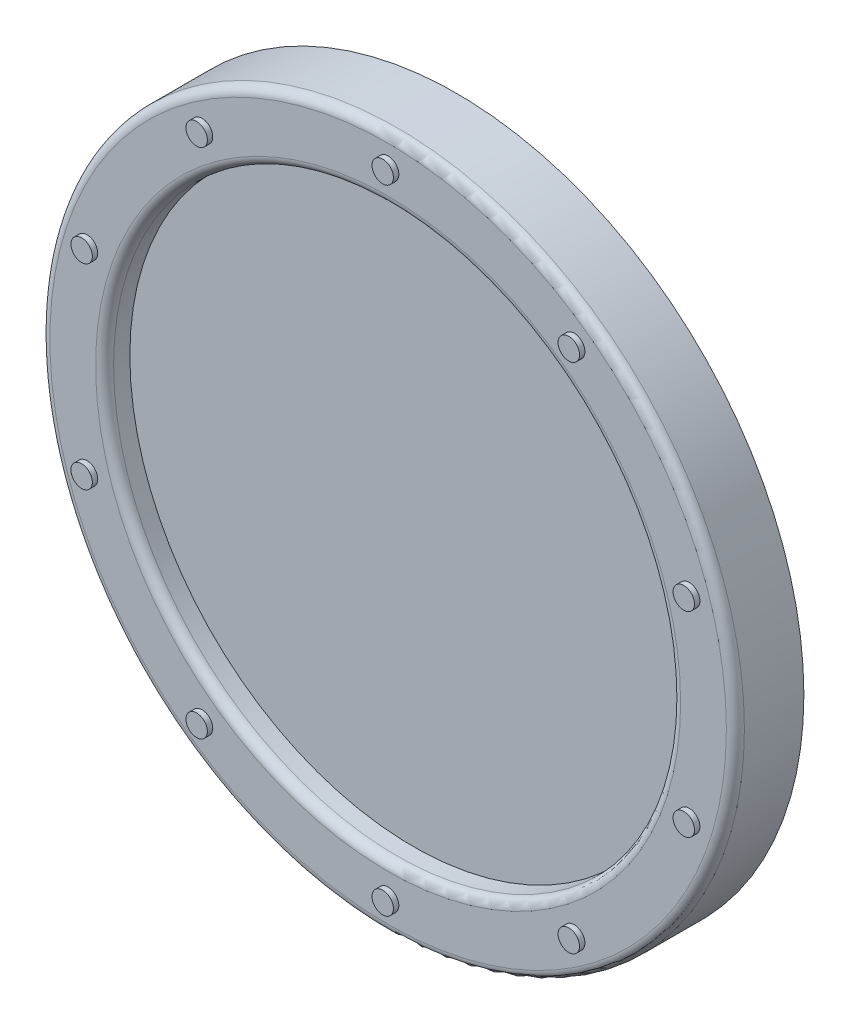
ISO-10303-21;
HEADER;
FILE_DESCRIPTION(('STEP AP214'),'2;1');
FILE_NAME('part.step','',(''),(''),'','','');
FILE_SCHEMA(('AUTOMOTIVE_DESIGN { 1 0 10303 214 1 1 1 1 }'));
ENDSEC;
DATA;
#1=APPLICATION_CONTEXT('core data for automotive mechanical design processes');
#2=APPLICATION_PROTOCOL_DEFINITION('international standard','automotive_design',2000,#1);
#3=PRODUCT_CONTEXT('',#1,'mechanical');
#4=PRODUCT('Part','Part','',(#3));
#5=PRODUCT_RELATED_PRODUCT_CATEGORY('part','',(#4));
#6=PRODUCT_DEFINITION_FORMATION('','',#4);
#7=PRODUCT_DEFINITION_CONTEXT('part definition',#1,'design');
#8=PRODUCT_DEFINITION('design','',#6,#7);
#9=PRODUCT_DEFINITION_SHAPE('','',#8);
#10=(LENGTH_UNIT() NAMED_UNIT(*) SI_UNIT(.MILLI.,.METRE.));
#11=(NAMED_UNIT(*) PLANE_ANGLE_UNIT() SI_UNIT($,.RADIAN.));
#12=(NAMED_UNIT(*) SI_UNIT($,.STERADIAN.) SOLID_ANGLE_UNIT());
#13=UNCERTAINTY_MEASURE_WITH_UNIT(LENGTH_MEASURE(1.E-05),#10,'distance_accuracy_value','');
#14=(GEOMETRIC_REPRESENTATION_CONTEXT(3) GLOBAL_UNCERTAINTY_ASSIGNED_CONTEXT((#13)) GLOBAL_UNIT_ASSIGNED_CONTEXT((#10,
#11,#12)) REPRESENTATION_CONTEXT('',''));
#15=CARTESIAN_POINT('',(0.,0.,0.));
#16=DIRECTION('',(0.,0.,1.));
#17=DIRECTION('',(1.,0.,0.));
#18=AXIS2_PLACEMENT_3D('',#15,#16,#17);
#19=CARTESIAN_POINT('',(-180.105067614424,94.8006119972261,-28.));
#20=DIRECTION('',(0.,0.,-1.));
#21=DIRECTION('',(-1.,0.,0.));
#22=AXIS2_PLACEMENT_3D('',#19,#20,#21);
#23=CYLINDRICAL_SURFACE('',#22,342.381897501648);
#24=CARTESIAN_POINT('',(-180.105067614424,94.8006119972261,-28.));
#25=DIRECTION('',(0.,0.,-1.));
#26=DIRECTION('',(-1.,0.,0.));
#27=AXIS2_PLACEMENT_3D('',#24,#25,#26);
#28=CIRCLE('',#27,342.381897501648);
#29=CARTESIAN_POINT('',(-522.486965116072,94.8006119972261,-28.));
#30=VERTEX_POINT('',#29);
#31=EDGE_CURVE('E11',#30,#30,#28,.T.);
#32=ORIENTED_EDGE('',*,*,#31,.T.);
#33=EDGE_LOOP('',(#32));
#34=FACE_BOUND('',#33,.T.);
#35=CARTESIAN_POINT('',(-180.105067614424,94.8006119972261,-76.));
#36=DIRECTION('',(0.,0.,-1.));
#37=DIRECTION('',(-1.,0.,0.));
#38=AXIS2_PLACEMENT_3D('',#35,#36,#37);
#39=CIRCLE('',#38,342.381897501648);
#40=CARTESIAN_POINT('',(-522.486965116072,94.8006119972261,-76.));
#41=VERTEX_POINT('',#40);
#42=EDGE_CURVE('E46',#41,#41,#39,.T.);
#43=ORIENTED_EDGE('',*,*,#42,.F.);
#44=EDGE_LOOP('',(#43));
#45=FACE_BOUND('',#44,.T.);
#46=ADVANCED_FACE('F43',(#34,#45),#23,.T.);
#47=CARTESIAN_POINT('',(-180.105067614424,94.8006119972261,-28.));
#48=DIRECTION('',(0.,0.,-1.));
#49=DIRECTION('',(-1.,0.,0.));
#50=AXIS2_PLACEMENT_3D('',#47,#48,#49);
#51=PLANE('',#50);
#52=ORIENTED_EDGE('',*,*,#31,.F.);
#53=EDGE_LOOP('',(#52));
#54=FACE_BOUND('',#53,.T.);
#55=ADVANCED_FACE('F58',(#54),#51,.F.);
#56=CARTESIAN_POINT('',(-180.105067614424,94.8006119972261,-76.));
#57=DIRECTION('',(0.,0.,-1.));
#58=DIRECTION('',(-1.,0.,0.));
#59=AXIS2_PLACEMENT_3D('',#56,#57,#58);
#60=PLANE('',#59);
#61=ORIENTED_EDGE('',*,*,#42,.T.);
#62=EDGE_LOOP('',(#61));
#63=FACE_BOUND('',#62,.T.);
#64=ADVANCED_FACE('F55',(#63),#60,.T.);
#65=CLOSED_SHELL('',(#46,#55,#64));
#66=MANIFOLD_SOLID_BREP('B2',#65);
#67=CARTESIAN_POINT('',(-180.105067614424,94.8006119972261,0.));
#68=DIRECTION('',(0.,0.,1.));
#69=DIRECTION('',(1.,0.,0.));
#70=AXIS2_PLACEMENT_3D('',#67,#68,#69);
#71=PLANE('',#70);
#72=CARTESIAN_POINT('',(-514.210186194246,203.357945636016,0.));
#73=DIRECTION('',(0.,0.,1.));
#74=DIRECTION('',(1.,0.,0.));
#75=AXIS2_PLACEMENT_3D('',#72,#73,#74);
#76=CIRCLE('',#75,11.8901500205174);
#77=CARTESIAN_POINT('',(-502.320036173729,203.357945636016,0.));
#78=VERTEX_POINT('',#77);
#79=EDGE_CURVE('E159',#78,#78,#76,.T.);
#80=ORIENTED_EDGE('',*,*,#79,.F.);
#81=EDGE_LOOP('',(#80));
#82=FACE_BOUND('',#81,.T.);
#83=CARTESIAN_POINT('',(-386.593386712017,-189.4061771973,0.));
#84=DIRECTION('',(0.,0.,1.));
#85=DIRECTION('',(1.,0.,0.));
#86=AXIS2_PLACEMENT_3D('',#83,#84,#85);
#87=CIRCLE('',#86,11.8901500205175);
#88=CARTESIAN_POINT('',(-374.703236691499,-189.4061771973,0.));
#89=VERTEX_POINT('',#88);
#90=EDGE_CURVE('E147',#89,#89,#87,.T.);
#91=ORIENTED_EDGE('',*,*,#90,.F.);
#92=EDGE_LOOP('',(#91));
#93=FACE_BOUND('',#92,.T.);
#94=CARTESIAN_POINT('',(26.3832514833078,-189.406177197256,0.));
#95=DIRECTION('',(0.,0.,1.));
#96=DIRECTION('',(1.,0.,0.));
#97=AXIS2_PLACEMENT_3D('',#94,#95,#96);
#98=CIRCLE('',#97,11.8901500205175);
#99=CARTESIAN_POINT('',(38.2734015038253,-189.406177197256,0.));
#100=VERTEX_POINT('',#99);
#101=EDGE_CURVE('E135',#100,#100,#98,.T.);
#102=ORIENTED_EDGE('',*,*,#101,.F.);
#103=EDGE_LOOP('',(#102));
#104=FACE_BOUND('',#103,.T.);
#105=CARTESIAN_POINT('',(154.000050965454,203.357945636087,0.));
#106=DIRECTION('',(0.,0.,1.));
#107=DIRECTION('',(1.,0.,0.));
#108=AXIS2_PLACEMENT_3D('',#105,#106,#107);
#109=CIRCLE('',#108,11.8901500205175);
#110=CARTESIAN_POINT('',(165.890200985972,203.357945636087,0.));
#111=VERTEX_POINT('',#110);
#112=EDGE_CURVE('E123',#111,#111,#109,.T.);
#113=ORIENTED_EDGE('',*,*,#112,.F.);
#114=EDGE_LOOP('',(#113));
#115=FACE_BOUND('',#114,.T.);
#116=CARTESIAN_POINT('',(-180.105067614424,446.099523108586,0.));
#117=DIRECTION('',(0.,0.,1.));
#118=DIRECTION('',(1.,0.,0.));
#119=AXIS2_PLACEMENT_3D('',#116,#117,#118);
#120=CIRCLE('',#119,11.8901500205175);
#121=CARTESIAN_POINT('',(-168.214917593907,446.099523108586,0.));
#122=VERTEX_POINT('',#121);
#123=EDGE_CURVE('E111',#122,#122,#120,.T.);
#124=ORIENTED_EDGE('',*,*,#123,.F.);
#125=EDGE_LOOP('',(#124));
#126=FACE_BOUND('',#125,.T.);
#127=CARTESIAN_POINT('',(-180.105067614424,94.8006119972261,0.));
#128=DIRECTION('',(0.,0.,1.));
#129=DIRECTION('',(1.,0.,0.));
#130=AXIS2_PLACEMENT_3D('',#127,#128,#129);
#131=CIRCLE('',#130,375.386266526947);
#132=CARTESIAN_POINT('',(195.281198912522,94.8006119972261,0.));
#133=VERTEX_POINT('',#132);
#134=EDGE_CURVE('E91',#133,#133,#131,.T.);
#135=ORIENTED_EDGE('',*,*,#134,.T.);
#136=EDGE_LOOP('',(#135));
#137=FACE_BOUND('',#136,.T.);
#138=CARTESIAN_POINT('',(-180.105067614424,94.8006119972261,0.));
#139=DIRECTION('',(0.,0.,1.));
#140=DIRECTION('',(1.,0.,0.));
#141=AXIS2_PLACEMENT_3D('',#138,#139,#140);
#142=CIRCLE('',#141,324.620020727405);
#143=CARTESIAN_POINT('',(144.51495311298,94.8006119972261,0.));
#144=VERTEX_POINT('',#143);
#145=EDGE_CURVE('E95',#144,#144,#142,.F.);
#146=ORIENTED_EDGE('',*,*,#145,.T.);
#147=EDGE_LOOP('',(#146));
#148=FACE_BOUND('',#147,.T.);
#149=CARTESIAN_POINT('',(26.3832514832454,379.007401191753,0.));
#150=DIRECTION('',(0.,0.,1.));
#151=DIRECTION('',(1.,0.,0.));
#152=AXIS2_PLACEMENT_3D('',#149,#150,#151);
#153=CIRCLE('',#152,11.8901500205174);
#154=CARTESIAN_POINT('',(38.2734015037628,379.007401191753,0.));
#155=VERTEX_POINT('',#154);
#156=EDGE_CURVE('E117',#155,#155,#153,.T.);
#157=ORIENTED_EDGE('',*,*,#156,.F.);
#158=EDGE_LOOP('',(#157));
#159=FACE_BOUND('',#158,.T.);
#160=CARTESIAN_POINT('',(154.000050965478,-13.7567216415617,0.));
#161=DIRECTION('',(0.,0.,1.));
#162=DIRECTION('',(1.,0.,0.));
#163=AXIS2_PLACEMENT_3D('',#160,#161,#162);
#164=CIRCLE('',#163,11.8901500205175);
#165=CARTESIAN_POINT('',(165.890200985996,-13.7567216415617,0.));
#166=VERTEX_POINT('',#165);
#167=EDGE_CURVE('E129',#166,#166,#164,.T.);
#168=ORIENTED_EDGE('',*,*,#167,.F.);
#169=EDGE_LOOP('',(#168));
#170=FACE_BOUND('',#169,.T.);
#171=CARTESIAN_POINT('',(-180.105067614347,-256.498299114134,0.));
#172=DIRECTION('',(0.,0.,1.));
#173=DIRECTION('',(1.,0.,0.));
#174=AXIS2_PLACEMENT_3D('',#171,#172,#173);
#175=CIRCLE('',#174,11.8901500205175);
#176=CARTESIAN_POINT('',(-168.21491759383,-256.498299114134,0.));
#177=VERTEX_POINT('',#176);
#178=EDGE_CURVE('E141',#177,#177,#175,.T.);
#179=ORIENTED_EDGE('',*,*,#178,.F.);
#180=EDGE_LOOP('',(#179));
#181=FACE_BOUND('',#180,.T.);
#182=CARTESIAN_POINT('',(-514.210186194224,-13.7567216416328,0.));
#183=DIRECTION('',(0.,0.,1.));
#184=DIRECTION('',(1.,0.,0.));
#185=AXIS2_PLACEMENT_3D('',#182,#183,#184);
#186=CIRCLE('',#185,11.8901500205175);
#187=CARTESIAN_POINT('',(-502.320036173706,-13.7567216416328,0.));
#188=VERTEX_POINT('',#187);
#189=EDGE_CURVE('E153',#188,#188,#186,.T.);
#190=ORIENTED_EDGE('',*,*,#189,.F.);
#191=EDGE_LOOP('',(#190));
#192=FACE_BOUND('',#191,.T.);
#193=CARTESIAN_POINT('',(-386.593386712075,379.00740119171,0.));
#194=DIRECTION('',(0.,0.,1.));
#195=DIRECTION('',(1.,0.,0.));
#196=AXIS2_PLACEMENT_3D('',#193,#194,#195);
#197=CIRCLE('',#196,11.8901500205175);
#198=CARTESIAN_POINT('',(-374.703236691557,379.00740119171,0.));
#199=VERTEX_POINT('',#198);
#200=EDGE_CURVE('E165',#199,#199,#197,.T.);
#201=ORIENTED_EDGE('',*,*,#200,.F.);
#202=EDGE_LOOP('',(#201));
#203=FACE_BOUND('',#202,.T.);
#204=ADVANCED_FACE('F84',(#82,#93,#104,#115,#126,#137,#148,#159,#170,#181,#192,#203),#71,.T.);
#205=CARTESIAN_POINT('',(-180.105067614424,94.8006119972261,-76.));
#206=DIRECTION('',(0.,0.,1.));
#207=DIRECTION('',(1.,0.,0.));
#208=AXIS2_PLACEMENT_3D('',#205,#206,#207);
#209=CYLINDRICAL_SURFACE('',#208,385.386266526947);
#210=CARTESIAN_POINT('',(-180.105067614424,94.8006119972261,-9.99999999999999));
#211=DIRECTION('',(0.,0.,1.));
#212=DIRECTION('',(1.,0.,0.));
#213=AXIS2_PLACEMENT_3D('',#210,#211,#212);
#214=CIRCLE('',#213,385.386266526947);
#215=CARTESIAN_POINT('',(205.281198912522,94.8006119972261,-9.99999999999999));
#216=VERTEX_POINT('',#215);
#217=EDGE_CURVE('E42',#216,#216,#214,.F.);
#218=ORIENTED_EDGE('',*,*,#217,.T.);
#219=EDGE_LOOP('',(#218));
#220=FACE_BOUND('',#219,.T.);
#221=CARTESIAN_POINT('',(-180.105067614424,94.8006119972261,-76.));
#222=DIRECTION('',(0.,0.,1.));
#223=DIRECTION('',(1.,0.,0.));
#224=AXIS2_PLACEMENT_3D('',#221,#222,#223);
#225=CIRCLE('',#224,385.386266526947);
#226=CARTESIAN_POINT('',(205.281198912522,94.8006119972261,-76.));
#227=VERTEX_POINT('',#226);
#228=EDGE_CURVE('E104',#227,#227,#225,.T.);
#229=ORIENTED_EDGE('',*,*,#228,.T.);
#230=EDGE_LOOP('',(#229));
#231=FACE_BOUND('',#230,.T.);
#232=ADVANCED_FACE('F181',(#220,#231),#209,.T.);
#233=CARTESIAN_POINT('',(-180.105067614424,94.8006119972261,-76.));
#234=DIRECTION('',(0.,0.,1.));
#235=DIRECTION('',(1.,0.,0.));
#236=AXIS2_PLACEMENT_3D('',#233,#234,#235);
#237=PLANE('',#236);
#238=CARTESIAN_POINT('',(-180.105067614424,94.8006119972261,-76.));
#239=DIRECTION('',(0.,0.,1.));
#240=DIRECTION('',(1.,0.,0.));
#241=AXIS2_PLACEMENT_3D('',#238,#239,#240);
#242=CIRCLE('',#241,314.620020727405);
#243=CARTESIAN_POINT('',(134.51495311298,94.8006119972261,-76.));
#244=VERTEX_POINT('',#243);
#245=EDGE_CURVE('E107',#244,#244,#242,.T.);
#246=ORIENTED_EDGE('',*,*,#245,.T.);
#247=EDGE_LOOP('',(#246));
#248=FACE_BOUND('',#247,.T.);
#249=ORIENTED_EDGE('',*,*,#228,.F.);
#250=EDGE_LOOP('',(#249));
#251=FACE_BOUND('',#250,.T.);
#252=ADVANCED_FACE('F187',(#248,#251),#237,.F.);
#253=CARTESIAN_POINT('',(-180.105067614424,94.8006119972261,-76.));
#254=DIRECTION('',(0.,0.,1.));
#255=DIRECTION('',(1.,0.,0.));
#256=AXIS2_PLACEMENT_3D('',#253,#254,#255);
#257=CYLINDRICAL_SURFACE('',#256,314.620020727405);
#258=CARTESIAN_POINT('',(-180.105067614424,94.8006119972261,-9.99999999999999));
#259=DIRECTION('',(0.,0.,1.));
#260=DIRECTION('',(1.,0.,0.));
#261=AXIS2_PLACEMENT_3D('',#258,#259,#260);
#262=CIRCLE('',#261,314.620020727405);
#263=CARTESIAN_POINT('',(134.51495311298,94.8006119972261,-9.99999999999999));
#264=VERTEX_POINT('',#263);
#265=EDGE_CURVE('E99',#264,#264,#262,.T.);
#266=ORIENTED_EDGE('',*,*,#265,.T.);
#267=EDGE_LOOP('',(#266));
#268=FACE_BOUND('',#267,.T.);
#269=ORIENTED_EDGE('',*,*,#245,.F.);
#270=EDGE_LOOP('',(#269));
#271=FACE_BOUND('',#270,.T.);
#272=ADVANCED_FACE('F195',(#268,#271),#257,.F.);
#273=CARTESIAN_POINT('',(-180.105067614424,94.8006119972261,-9.99999999999999));
#274=DIRECTION('',(0.,0.,1.));
#275=DIRECTION('',(1.,0.,0.));
#276=AXIS2_PLACEMENT_3D('',#273,#274,#275);
#277=TOROIDAL_SURFACE('',#276,324.620020727405,10.);
#278=ORIENTED_EDGE('',*,*,#145,.F.);
#279=EDGE_LOOP('',(#278));
#280=FACE_BOUND('',#279,.T.);
#281=ORIENTED_EDGE('',*,*,#265,.F.);
#282=EDGE_LOOP('',(#281));
#283=FACE_BOUND('',#282,.T.);
#284=ADVANCED_FACE('F193',(#280,#283),#277,.T.);
#285=CARTESIAN_POINT('',(-180.105067614424,94.8006119972261,-9.99999999999999));
#286=DIRECTION('',(0.,0.,1.));
#287=DIRECTION('',(1.,0.,0.));
#288=AXIS2_PLACEMENT_3D('',#285,#286,#287);
#289=TOROIDAL_SURFACE('',#288,375.386266526947,10.);
#290=ORIENTED_EDGE('',*,*,#217,.F.);
#291=EDGE_LOOP('',(#290));
#292=FACE_BOUND('',#291,.T.);
#293=ORIENTED_EDGE('',*,*,#134,.F.);
#294=EDGE_LOOP('',(#293));
#295=FACE_BOUND('',#294,.T.);
#296=ADVANCED_FACE('F86',(#292,#295),#289,.T.);
#297=CARTESIAN_POINT('',(-180.105067614424,446.099523108586,6.00000000000001));
#298=DIRECTION('',(0.,0.,-1.));
#299=DIRECTION('',(-1.,0.,0.));
#300=AXIS2_PLACEMENT_3D('',#297,#298,#299);
#301=CYLINDRICAL_SURFACE('',#300,11.8901500205175);
#302=CARTESIAN_POINT('',(-180.105067614424,446.099523108586,6.00000000000001));
#303=DIRECTION('',(0.,0.,1.));
#304=DIRECTION('',(1.,0.,0.));
#305=AXIS2_PLACEMENT_3D('',#302,#303,#304);
#306=CIRCLE('',#305,11.8901500205175);
#307=CARTESIAN_POINT('',(-168.214917593907,446.099523108586,6.00000000000001));
#308=VERTEX_POINT('',#307);
#309=EDGE_CURVE('E110',#308,#308,#306,.T.);
#310=ORIENTED_EDGE('',*,*,#309,.F.);
#311=EDGE_LOOP('',(#310));
#312=FACE_BOUND('',#311,.T.);
#313=ORIENTED_EDGE('',*,*,#123,.T.);
#314=EDGE_LOOP('',(#313));
#315=FACE_BOUND('',#314,.T.);
#316=ADVANCED_FACE('F201',(#312,#315),#301,.T.);
#317=CARTESIAN_POINT('',(-180.105067614424,446.099523108586,6.00000000000001));
#318=DIRECTION('',(0.,0.,1.));
#319=DIRECTION('',(1.,0.,0.));
#320=AXIS2_PLACEMENT_3D('',#317,#318,#319);
#321=PLANE('',#320);
#322=ORIENTED_EDGE('',*,*,#309,.T.);
#323=EDGE_LOOP('',(#322));
#324=FACE_BOUND('',#323,.T.);
#325=ADVANCED_FACE('F249',(#324),#321,.T.);
#326=CARTESIAN_POINT('',(26.3832514832454,379.007401191753,6.00000000000001));
#327=DIRECTION('',(0.,0.,-1.));
#328=DIRECTION('',(-1.,0.,0.));
#329=AXIS2_PLACEMENT_3D('',#326,#327,#328);
#330=CYLINDRICAL_SURFACE('',#329,11.8901500205174);
#331=CARTESIAN_POINT('',(26.3832514832454,379.007401191753,6.00000000000001));
#332=DIRECTION('',(0.,0.,1.));
#333=DIRECTION('',(1.,0.,0.));
#334=AXIS2_PLACEMENT_3D('',#331,#332,#333);
#335=CIRCLE('',#334,11.8901500205174);
#336=CARTESIAN_POINT('',(38.2734015037628,379.007401191753,6.00000000000001));
#337=VERTEX_POINT('',#336);
#338=EDGE_CURVE('E114',#337,#337,#335,.T.);
#339=ORIENTED_EDGE('',*,*,#338,.F.);
#340=EDGE_LOOP('',(#339));
#341=FACE_BOUND('',#340,.T.);
#342=ORIENTED_EDGE('',*,*,#156,.T.);
#343=EDGE_LOOP('',(#342));
#344=FACE_BOUND('',#343,.T.);
#345=ADVANCED_FACE('F259',(#341,#344),#330,.T.);
#346=CARTESIAN_POINT('',(26.3832514832454,379.007401191753,6.00000000000001));
#347=DIRECTION('',(0.,0.,1.));
#348=DIRECTION('',(1.,0.,0.));
#349=AXIS2_PLACEMENT_3D('',#346,#347,#348);
#350=PLANE('',#349);
#351=ORIENTED_EDGE('',*,*,#338,.T.);
#352=EDGE_LOOP('',(#351));
#353=FACE_BOUND('',#352,.T.);
#354=ADVANCED_FACE('F269',(#353),#350,.T.);
#355=CARTESIAN_POINT('',(154.000050965454,203.357945636087,6.00000000000001));
#356=DIRECTION('',(0.,0.,-1.));
#357=DIRECTION('',(-1.,0.,0.));
#358=AXIS2_PLACEMENT_3D('',#355,#356,#357);
#359=CYLINDRICAL_SURFACE('',#358,11.8901500205175);
#360=CARTESIAN_POINT('',(154.000050965454,203.357945636087,6.00000000000001));
#361=DIRECTION('',(0.,0.,1.));
#362=DIRECTION('',(1.,0.,0.));
#363=AXIS2_PLACEMENT_3D('',#360,#361,#362);
#364=CIRCLE('',#363,11.8901500205175);
#365=CARTESIAN_POINT('',(165.890200985972,203.357945636087,6.00000000000001));
#366=VERTEX_POINT('',#365);
#367=EDGE_CURVE('E120',#366,#366,#364,.T.);
#368=ORIENTED_EDGE('',*,*,#367,.F.);
#369=EDGE_LOOP('',(#368));
#370=FACE_BOUND('',#369,.T.);
#371=ORIENTED_EDGE('',*,*,#112,.T.);
#372=EDGE_LOOP('',(#371));
#373=FACE_BOUND('',#372,.T.);
#374=ADVANCED_FACE('F279',(#370,#373),#359,.T.);
#375=CARTESIAN_POINT('',(154.000050965454,203.357945636087,6.00000000000001));
#376=DIRECTION('',(0.,0.,1.));
#377=DIRECTION('',(1.,0.,0.));
#378=AXIS2_PLACEMENT_3D('',#375,#376,#377);
#379=PLANE('',#378);
#380=ORIENTED_EDGE('',*,*,#367,.T.);
#381=EDGE_LOOP('',(#380));
#382=FACE_BOUND('',#381,.T.);
#383=ADVANCED_FACE('F289',(#382),#379,.T.);
#384=CARTESIAN_POINT('',(154.000050965478,-13.7567216415617,6.00000000000001));
#385=DIRECTION('',(0.,0.,-1.));
#386=DIRECTION('',(-1.,0.,0.));
#387=AXIS2_PLACEMENT_3D('',#384,#385,#386);
#388=CYLINDRICAL_SURFACE('',#387,11.8901500205175);
#389=CARTESIAN_POINT('',(154.000050965478,-13.7567216415617,6.00000000000001));
#390=DIRECTION('',(0.,0.,1.));
#391=DIRECTION('',(1.,0.,0.));
#392=AXIS2_PLACEMENT_3D('',#389,#390,#391);
#393=CIRCLE('',#392,11.8901500205175);
#394=CARTESIAN_POINT('',(165.890200985996,-13.7567216415617,6.00000000000001));
#395=VERTEX_POINT('',#394);
#396=EDGE_CURVE('E126',#395,#395,#393,.T.);
#397=ORIENTED_EDGE('',*,*,#396,.F.);
#398=EDGE_LOOP('',(#397));
#399=FACE_BOUND('',#398,.T.);
#400=ORIENTED_EDGE('',*,*,#167,.T.);
#401=EDGE_LOOP('',(#400));
#402=FACE_BOUND('',#401,.T.);
#403=ADVANCED_FACE('F299',(#399,#402),#388,.T.);
#404=CARTESIAN_POINT('',(154.000050965478,-13.7567216415617,6.00000000000001));
#405=DIRECTION('',(0.,0.,1.));
#406=DIRECTION('',(1.,0.,0.));
#407=AXIS2_PLACEMENT_3D('',#404,#405,#406);
#408=PLANE('',#407);
#409=ORIENTED_EDGE('',*,*,#396,.T.);
#410=EDGE_LOOP('',(#409));
#411=FACE_BOUND('',#410,.T.);
#412=ADVANCED_FACE('F309',(#411),#408,.T.);
#413=CARTESIAN_POINT('',(26.3832514833078,-189.406177197256,6.00000000000001));
#414=DIRECTION('',(0.,0.,-1.));
#415=DIRECTION('',(-1.,0.,0.));
#416=AXIS2_PLACEMENT_3D('',#413,#414,#415);
#417=CYLINDRICAL_SURFACE('',#416,11.8901500205175);
#418=CARTESIAN_POINT('',(26.3832514833078,-189.406177197256,6.00000000000001));
#419=DIRECTION('',(0.,0.,1.));
#420=DIRECTION('',(1.,0.,0.));
#421=AXIS2_PLACEMENT_3D('',#418,#419,#420);
#422=CIRCLE('',#421,11.8901500205175);
#423=CARTESIAN_POINT('',(38.2734015038253,-189.406177197256,6.00000000000001));
#424=VERTEX_POINT('',#423);
#425=EDGE_CURVE('E132',#424,#424,#422,.T.);
#426=ORIENTED_EDGE('',*,*,#425,.F.);
#427=EDGE_LOOP('',(#426));
#428=FACE_BOUND('',#427,.T.);
#429=ORIENTED_EDGE('',*,*,#101,.T.);
#430=EDGE_LOOP('',(#429));
#431=FACE_BOUND('',#430,.T.);
#432=ADVANCED_FACE('F319',(#428,#431),#417,.T.);
#433=CARTESIAN_POINT('',(26.3832514833078,-189.406177197256,6.00000000000001));
#434=DIRECTION('',(0.,0.,1.));
#435=DIRECTION('',(1.,0.,0.));
#436=AXIS2_PLACEMENT_3D('',#433,#434,#435);
#437=PLANE('',#436);
#438=ORIENTED_EDGE('',*,*,#425,.T.);
#439=EDGE_LOOP('',(#438));
#440=FACE_BOUND('',#439,.T.);
#441=ADVANCED_FACE('F329',(#440),#437,.T.);
#442=CARTESIAN_POINT('',(-180.105067614347,-256.498299114134,6.00000000000001));
#443=DIRECTION('',(0.,0.,-1.));
#444=DIRECTION('',(-1.,0.,0.));
#445=AXIS2_PLACEMENT_3D('',#442,#443,#444);
#446=CYLINDRICAL_SURFACE('',#445,11.8901500205175);
#447=CARTESIAN_POINT('',(-180.105067614347,-256.498299114134,6.00000000000001));
#448=DIRECTION('',(0.,0.,1.));
#449=DIRECTION('',(1.,0.,0.));
#450=AXIS2_PLACEMENT_3D('',#447,#448,#449);
#451=CIRCLE('',#450,11.8901500205175);
#452=CARTESIAN_POINT('',(-168.21491759383,-256.498299114134,6.00000000000001));
#453=VERTEX_POINT('',#452);
#454=EDGE_CURVE('E138',#453,#453,#451,.T.);
#455=ORIENTED_EDGE('',*,*,#454,.F.);
#456=EDGE_LOOP('',(#455));
#457=FACE_BOUND('',#456,.T.);
#458=ORIENTED_EDGE('',*,*,#178,.T.);
#459=EDGE_LOOP('',(#458));
#460=FACE_BOUND('',#459,.T.);
#461=ADVANCED_FACE('F339',(#457,#460),#446,.T.);
#462=CARTESIAN_POINT('',(-180.105067614347,-256.498299114134,6.00000000000001));
#463=DIRECTION('',(0.,0.,1.));
#464=DIRECTION('',(1.,0.,0.));
#465=AXIS2_PLACEMENT_3D('',#462,#463,#464);
#466=PLANE('',#465);
#467=ORIENTED_EDGE('',*,*,#454,.T.);
#468=EDGE_LOOP('',(#467));
#469=FACE_BOUND('',#468,.T.);
#470=ADVANCED_FACE('F349',(#469),#466,.T.);
#471=CARTESIAN_POINT('',(-386.593386712017,-189.4061771973,6.00000000000001));
#472=DIRECTION('',(0.,0.,-1.));
#473=DIRECTION('',(-1.,0.,0.));
#474=AXIS2_PLACEMENT_3D('',#471,#472,#473);
#475=CYLINDRICAL_SURFACE('',#474,11.8901500205175);
#476=CARTESIAN_POINT('',(-386.593386712017,-189.4061771973,6.00000000000001));
#477=DIRECTION('',(0.,0.,1.));
#478=DIRECTION('',(1.,0.,0.));
#479=AXIS2_PLACEMENT_3D('',#476,#477,#478);
#480=CIRCLE('',#479,11.8901500205175);
#481=CARTESIAN_POINT('',(-374.703236691499,-189.4061771973,6.00000000000001));
#482=VERTEX_POINT('',#481);
#483=EDGE_CURVE('E144',#482,#482,#480,.T.);
#484=ORIENTED_EDGE('',*,*,#483,.F.);
#485=EDGE_LOOP('',(#484));
#486=FACE_BOUND('',#485,.T.);
#487=ORIENTED_EDGE('',*,*,#90,.T.);
#488=EDGE_LOOP('',(#487));
#489=FACE_BOUND('',#488,.T.);
#490=ADVANCED_FACE('F359',(#486,#489),#475,.T.);
#491=CARTESIAN_POINT('',(-386.593386712017,-189.4061771973,6.00000000000001));
#492=DIRECTION('',(0.,0.,1.));
#493=DIRECTION('',(1.,0.,0.));
#494=AXIS2_PLACEMENT_3D('',#491,#492,#493);
#495=PLANE('',#494);
#496=ORIENTED_EDGE('',*,*,#483,.T.);
#497=EDGE_LOOP('',(#496));
#498=FACE_BOUND('',#497,.T.);
#499=ADVANCED_FACE('F369',(#498),#495,.T.);
#500=CARTESIAN_POINT('',(-514.210186194224,-13.7567216416328,6.00000000000001));
#501=DIRECTION('',(0.,0.,-1.));
#502=DIRECTION('',(-1.,0.,0.));
#503=AXIS2_PLACEMENT_3D('',#500,#501,#502);
#504=CYLINDRICAL_SURFACE('',#503,11.8901500205175);
#505=CARTESIAN_POINT('',(-514.210186194224,-13.7567216416328,6.00000000000001));
#506=DIRECTION('',(0.,0.,1.));
#507=DIRECTION('',(1.,0.,0.));
#508=AXIS2_PLACEMENT_3D('',#505,#506,#507);
#509=CIRCLE('',#508,11.8901500205175);
#510=CARTESIAN_POINT('',(-502.320036173706,-13.7567216416328,6.00000000000001));
#511=VERTEX_POINT('',#510);
#512=EDGE_CURVE('E150',#511,#511,#509,.T.);
#513=ORIENTED_EDGE('',*,*,#512,.F.);
#514=EDGE_LOOP('',(#513));
#515=FACE_BOUND('',#514,.T.);
#516=ORIENTED_EDGE('',*,*,#189,.T.);
#517=EDGE_LOOP('',(#516));
#518=FACE_BOUND('',#517,.T.);
#519=ADVANCED_FACE('F379',(#515,#518),#504,.T.);
#520=CARTESIAN_POINT('',(-514.210186194224,-13.7567216416328,6.00000000000001));
#521=DIRECTION('',(0.,0.,1.));
#522=DIRECTION('',(1.,0.,0.));
#523=AXIS2_PLACEMENT_3D('',#520,#521,#522);
#524=PLANE('',#523);
#525=ORIENTED_EDGE('',*,*,#512,.T.);
#526=EDGE_LOOP('',(#525));
#527=FACE_BOUND('',#526,.T.);
#528=ADVANCED_FACE('F389',(#527),#524,.T.);
#529=CARTESIAN_POINT('',(-514.210186194246,203.357945636016,6.00000000000001));
#530=DIRECTION('',(0.,0.,-1.));
#531=DIRECTION('',(-1.,0.,0.));
#532=AXIS2_PLACEMENT_3D('',#529,#530,#531);
#533=CYLINDRICAL_SURFACE('',#532,11.8901500205174);
#534=CARTESIAN_POINT('',(-514.210186194246,203.357945636016,6.00000000000001));
#535=DIRECTION('',(0.,0.,1.));
#536=DIRECTION('',(1.,0.,0.));
#537=AXIS2_PLACEMENT_3D('',#534,#535,#536);
#538=CIRCLE('',#537,11.8901500205174);
#539=CARTESIAN_POINT('',(-502.320036173729,203.357945636016,6.00000000000001));
#540=VERTEX_POINT('',#539);
#541=EDGE_CURVE('E156',#540,#540,#538,.T.);
#542=ORIENTED_EDGE('',*,*,#541,.F.);
#543=EDGE_LOOP('',(#542));
#544=FACE_BOUND('',#543,.T.);
#545=ORIENTED_EDGE('',*,*,#79,.T.);
#546=EDGE_LOOP('',(#545));
#547=FACE_BOUND('',#546,.T.);
#548=ADVANCED_FACE('F399',(#544,#547),#533,.T.);
#549=CARTESIAN_POINT('',(-514.210186194246,203.357945636016,6.00000000000001));
#550=DIRECTION('',(0.,0.,1.));
#551=DIRECTION('',(1.,0.,0.));
#552=AXIS2_PLACEMENT_3D('',#549,#550,#551);
#553=PLANE('',#552);
#554=ORIENTED_EDGE('',*,*,#541,.T.);
#555=EDGE_LOOP('',(#554));
#556=FACE_BOUND('',#555,.T.);
#557=ADVANCED_FACE('F176',(#556),#553,.T.);
#558=CARTESIAN_POINT('',(-386.593386712075,379.00740119171,6.00000000000001));
#559=DIRECTION('',(0.,0.,-1.));
#560=DIRECTION('',(-1.,0.,0.));
#561=AXIS2_PLACEMENT_3D('',#558,#559,#560);
#562=CYLINDRICAL_SURFACE('',#561,11.8901500205175);
#563=CARTESIAN_POINT('',(-386.593386712075,379.00740119171,6.00000000000001));
#564=DIRECTION('',(0.,0.,1.));
#565=DIRECTION('',(1.,0.,0.));
#566=AXIS2_PLACEMENT_3D('',#563,#564,#565);
#567=CIRCLE('',#566,11.8901500205175);
#568=CARTESIAN_POINT('',(-374.703236691557,379.00740119171,6.00000000000001));
#569=VERTEX_POINT('',#568);
#570=EDGE_CURVE('E162',#569,#569,#567,.T.);
#571=ORIENTED_EDGE('',*,*,#570,.F.);
#572=EDGE_LOOP('',(#571));
#573=FACE_BOUND('',#572,.T.);
#574=ORIENTED_EDGE('',*,*,#200,.T.);
#575=EDGE_LOOP('',(#574));
#576=FACE_BOUND('',#575,.T.);
#577=ADVANCED_FACE('F173',(#573,#576),#562,.T.);
#578=CARTESIAN_POINT('',(-386.593386712075,379.00740119171,6.00000000000001));
#579=DIRECTION('',(0.,0.,1.));
#580=DIRECTION('',(1.,0.,0.));
#581=AXIS2_PLACEMENT_3D('',#578,#579,#580);
#582=PLANE('',#581);
#583=ORIENTED_EDGE('',*,*,#570,.T.);
#584=EDGE_LOOP('',(#583));
#585=FACE_BOUND('',#584,.T.);
#586=ADVANCED_FACE('F171',(#585),#582,.T.);
#587=CLOSED_SHELL('',(#204,#232,#252,#272,#284,#296,#316,#325,#345,#354,#374,#383,#403,#412,
#432,#441,#461,#470,#490,#499,#519,#528,#548,#557,#577,#586));
#588=MANIFOLD_SOLID_BREP('B6',#587);
#589=ADVANCED_BREP_SHAPE_REPRESENTATION('',(#18,#66,#588),#14);
#590=SHAPE_DEFINITION_REPRESENTATION(#9,#589);
ENDSEC;
END-ISO-10303-21;
